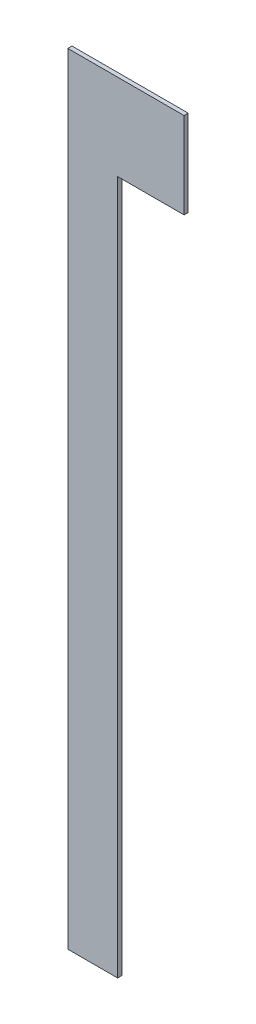
ISO-10303-21;
HEADER;
FILE_DESCRIPTION(('STEP AP214'),'2;1');
FILE_NAME('part.step','',(''),(''),'','','');
FILE_SCHEMA(('AUTOMOTIVE_DESIGN { 1 0 10303 214 1 1 1 1 }'));
ENDSEC;
DATA;
#1=APPLICATION_CONTEXT('core data for automotive mechanical design processes');
#2=APPLICATION_PROTOCOL_DEFINITION('international standard','automotive_design',2000,#1);
#3=PRODUCT_CONTEXT('',#1,'mechanical');
#4=PRODUCT('Part','Part','',(#3));
#5=PRODUCT_RELATED_PRODUCT_CATEGORY('part','',(#4));
#6=PRODUCT_DEFINITION_FORMATION('','',#4);
#7=PRODUCT_DEFINITION_CONTEXT('part definition',#1,'design');
#8=PRODUCT_DEFINITION('design','',#6,#7);
#9=PRODUCT_DEFINITION_SHAPE('','',#8);
#10=(LENGTH_UNIT() NAMED_UNIT(*) SI_UNIT(.MILLI.,.METRE.));
#11=(NAMED_UNIT(*) PLANE_ANGLE_UNIT() SI_UNIT($,.RADIAN.));
#12=(NAMED_UNIT(*) SI_UNIT($,.STERADIAN.) SOLID_ANGLE_UNIT());
#13=UNCERTAINTY_MEASURE_WITH_UNIT(LENGTH_MEASURE(1.E-05),#10,'distance_accuracy_value','');
#14=(GEOMETRIC_REPRESENTATION_CONTEXT(3) GLOBAL_UNCERTAINTY_ASSIGNED_CONTEXT((#13)) GLOBAL_UNIT_ASSIGNED_CONTEXT((#10,
#11,#12)) REPRESENTATION_CONTEXT('',''));
#15=CARTESIAN_POINT('',(0.,0.,0.));
#16=DIRECTION('',(0.,0.,1.));
#17=DIRECTION('',(1.,0.,0.));
#18=AXIS2_PLACEMENT_3D('',#15,#16,#17);
#19=CARTESIAN_POINT('',(350.000000000001,-0.749999999998696,-12.5));
#20=DIRECTION('',(1.,0.,0.));
#21=DIRECTION('',(0.,0.,-1.));
#22=AXIS2_PLACEMENT_3D('',#19,#20,#21);
#23=PLANE('',#22);
#24=DIRECTION('',(0.,1.,0.));
#25=VECTOR('',#24,1.);
#26=CARTESIAN_POINT('',(350.000000000001,-0.749999999998696,0.));
#27=LINE('',#26,#25);
#28=CARTESIAN_POINT('',(350.000000000001,-259.999999999998,0.));
#29=VERTEX_POINT('',#28);
#30=CARTESIAN_POINT('',(350.000000000001,-0.749999999998696,0.));
#31=VERTEX_POINT('',#30);
#32=EDGE_CURVE('E120',#29,#31,#27,.T.);
#33=ORIENTED_EDGE('',*,*,#32,.F.);
#34=DIRECTION('',(0.,0.,1.));
#35=VECTOR('',#34,1.);
#36=CARTESIAN_POINT('',(350.000000000001,-259.999999999998,-12.5));
#37=LINE('',#36,#35);
#38=CARTESIAN_POINT('',(350.000000000001,-259.999999999998,-12.5));
#39=VERTEX_POINT('',#38);
#40=EDGE_CURVE('E11',#39,#29,#37,.T.);
#41=ORIENTED_EDGE('',*,*,#40,.F.);
#42=DIRECTION('',(0.,1.,0.));
#43=VECTOR('',#42,1.);
#44=CARTESIAN_POINT('',(350.000000000001,-0.749999999998696,-12.5));
#45=LINE('',#44,#43);
#46=CARTESIAN_POINT('',(350.000000000001,-0.749999999998696,-12.5));
#47=VERTEX_POINT('',#46);
#48=EDGE_CURVE('E134',#39,#47,#45,.T.);
#49=ORIENTED_EDGE('',*,*,#48,.T.);
#50=DIRECTION('',(0.,0.,1.));
#51=VECTOR('',#50,1.);
#52=CARTESIAN_POINT('',(350.000000000001,-0.749999999998696,-12.5));
#53=LINE('',#52,#51);
#54=EDGE_CURVE('E38',#47,#31,#53,.T.);
#55=ORIENTED_EDGE('',*,*,#54,.T.);
#56=EDGE_LOOP('',(#33,#41,#49,#55));
#57=FACE_BOUND('',#56,.T.);
#58=ADVANCED_FACE('F35',(#57),#23,.T.);
#59=CARTESIAN_POINT('',(150.,-259.999999999998,-12.5));
#60=DIRECTION('',(0.,-1.,0.));
#61=DIRECTION('',(0.,0.,-1.));
#62=AXIS2_PLACEMENT_3D('',#59,#60,#61);
#63=PLANE('',#62);
#64=DIRECTION('',(1.,0.,0.));
#65=VECTOR('',#64,1.);
#66=CARTESIAN_POINT('',(150.,-259.999999999998,0.));
#67=LINE('',#66,#65);
#68=CARTESIAN_POINT('',(150.,-259.999999999998,0.));
#69=VERTEX_POINT('',#68);
#70=EDGE_CURVE('E132',#69,#29,#67,.T.);
#71=ORIENTED_EDGE('',*,*,#70,.F.);
#72=DIRECTION('',(0.,0.,1.));
#73=VECTOR('',#72,1.);
#74=CARTESIAN_POINT('',(150.,-259.999999999998,-12.5));
#75=LINE('',#74,#73);
#76=CARTESIAN_POINT('',(150.,-259.999999999998,-12.5));
#77=VERTEX_POINT('',#76);
#78=EDGE_CURVE('E44',#77,#69,#75,.T.);
#79=ORIENTED_EDGE('',*,*,#78,.F.);
#80=DIRECTION('',(1.,0.,0.));
#81=VECTOR('',#80,1.);
#82=CARTESIAN_POINT('',(150.,-259.999999999998,-12.5));
#83=LINE('',#82,#81);
#84=EDGE_CURVE('E110',#77,#39,#83,.T.);
#85=ORIENTED_EDGE('',*,*,#84,.T.);
#86=ORIENTED_EDGE('',*,*,#40,.T.);
#87=EDGE_LOOP('',(#71,#79,#85,#86));
#88=FACE_BOUND('',#87,.T.);
#89=ADVANCED_FACE('F142',(#88),#63,.T.);
#90=CARTESIAN_POINT('',(150.,-2350.,-12.5));
#91=DIRECTION('',(1.,0.,0.));
#92=DIRECTION('',(0.,0.,-1.));
#93=AXIS2_PLACEMENT_3D('',#90,#91,#92);
#94=PLANE('',#93);
#95=DIRECTION('',(0.,1.,0.));
#96=VECTOR('',#95,1.);
#97=CARTESIAN_POINT('',(150.,-2350.,0.));
#98=LINE('',#97,#96);
#99=CARTESIAN_POINT('',(150.,-2350.,0.));
#100=VERTEX_POINT('',#99);
#101=EDGE_CURVE('E97',#100,#69,#98,.T.);
#102=ORIENTED_EDGE('',*,*,#101,.F.);
#103=DIRECTION('',(0.,0.,1.));
#104=VECTOR('',#103,1.);
#105=CARTESIAN_POINT('',(150.,-2350.,-12.5));
#106=LINE('',#105,#104);
#107=CARTESIAN_POINT('',(150.,-2350.,-12.5));
#108=VERTEX_POINT('',#107);
#109=EDGE_CURVE('E92',#108,#100,#106,.T.);
#110=ORIENTED_EDGE('',*,*,#109,.F.);
#111=DIRECTION('',(0.,1.,0.));
#112=VECTOR('',#111,1.);
#113=CARTESIAN_POINT('',(150.,-2350.,-12.5));
#114=LINE('',#113,#112);
#115=EDGE_CURVE('E95',#108,#77,#114,.T.);
#116=ORIENTED_EDGE('',*,*,#115,.T.);
#117=ORIENTED_EDGE('',*,*,#78,.T.);
#118=EDGE_LOOP('',(#102,#110,#116,#117));
#119=FACE_BOUND('',#118,.T.);
#120=ADVANCED_FACE('F94',(#119),#94,.T.);
#121=CARTESIAN_POINT('',(150.,-2350.,-12.5));
#122=DIRECTION('',(0.,-1.,0.));
#123=DIRECTION('',(0.,0.,-1.));
#124=AXIS2_PLACEMENT_3D('',#121,#122,#123);
#125=PLANE('',#124);
#126=DIRECTION('',(1.,0.,0.));
#127=VECTOR('',#126,1.);
#128=CARTESIAN_POINT('',(150.,-2350.,0.));
#129=LINE('',#128,#127);
#130=CARTESIAN_POINT('',(-4.44089209850063E-13,-2350.,0.));
#131=VERTEX_POINT('',#130);
#132=EDGE_CURVE('E129',#131,#100,#129,.T.);
#133=ORIENTED_EDGE('',*,*,#132,.F.);
#134=DIRECTION('',(0.,0.,1.));
#135=VECTOR('',#134,1.);
#136=CARTESIAN_POINT('',(-4.44089209850063E-13,-2350.,-12.5));
#137=LINE('',#136,#135);
#138=CARTESIAN_POINT('',(-4.44089209850063E-13,-2350.,-12.5));
#139=VERTEX_POINT('',#138);
#140=EDGE_CURVE('E102',#139,#131,#137,.T.);
#141=ORIENTED_EDGE('',*,*,#140,.F.);
#142=DIRECTION('',(1.,0.,0.));
#143=VECTOR('',#142,1.);
#144=CARTESIAN_POINT('',(150.,-2350.,-12.5));
#145=LINE('',#144,#143);
#146=EDGE_CURVE('E108',#139,#108,#145,.T.);
#147=ORIENTED_EDGE('',*,*,#146,.T.);
#148=ORIENTED_EDGE('',*,*,#109,.T.);
#149=EDGE_LOOP('',(#133,#141,#147,#148));
#150=FACE_BOUND('',#149,.T.);
#151=ADVANCED_FACE('F112',(#150),#125,.T.);
#152=CARTESIAN_POINT('',(0.,-0.749999999998696,-12.5));
#153=DIRECTION('',(-1.,0.,0.));
#154=DIRECTION('',(0.,-1.,0.));
#155=AXIS2_PLACEMENT_3D('',#152,#153,#154);
#156=PLANE('',#155);
#157=DIRECTION('',(0.,-1.,0.));
#158=VECTOR('',#157,1.);
#159=CARTESIAN_POINT('',(0.,-0.749999999998696,0.));
#160=LINE('',#159,#158);
#161=CARTESIAN_POINT('',(0.,-0.749999999998696,0.));
#162=VERTEX_POINT('',#161);
#163=EDGE_CURVE('E126',#162,#131,#160,.T.);
#164=ORIENTED_EDGE('',*,*,#163,.F.);
#165=DIRECTION('',(0.,0.,1.));
#166=VECTOR('',#165,1.);
#167=CARTESIAN_POINT('',(0.,-0.749999999998696,-12.5));
#168=LINE('',#167,#166);
#169=CARTESIAN_POINT('',(0.,-0.749999999998696,-12.5));
#170=VERTEX_POINT('',#169);
#171=EDGE_CURVE('E137',#170,#162,#168,.T.);
#172=ORIENTED_EDGE('',*,*,#171,.F.);
#173=DIRECTION('',(0.,-1.,0.));
#174=VECTOR('',#173,1.);
#175=CARTESIAN_POINT('',(0.,-0.749999999998696,-12.5));
#176=LINE('',#175,#174);
#177=EDGE_CURVE('E113',#170,#139,#176,.T.);
#178=ORIENTED_EDGE('',*,*,#177,.T.);
#179=ORIENTED_EDGE('',*,*,#140,.T.);
#180=EDGE_LOOP('',(#164,#172,#178,#179));
#181=FACE_BOUND('',#180,.T.);
#182=ADVANCED_FACE('F155',(#181),#156,.T.);
#183=CARTESIAN_POINT('',(350.000000000001,-0.749999999998696,-12.5));
#184=DIRECTION('',(0.,1.,0.));
#185=DIRECTION('',(0.,0.,1.));
#186=AXIS2_PLACEMENT_3D('',#183,#184,#185);
#187=PLANE('',#186);
#188=DIRECTION('',(-1.,0.,0.));
#189=VECTOR('',#188,1.);
#190=CARTESIAN_POINT('',(350.000000000001,-0.749999999998696,0.));
#191=LINE('',#190,#189);
#192=EDGE_CURVE('E123',#31,#162,#191,.T.);
#193=ORIENTED_EDGE('',*,*,#192,.F.);
#194=ORIENTED_EDGE('',*,*,#54,.F.);
#195=DIRECTION('',(-1.,0.,0.));
#196=VECTOR('',#195,1.);
#197=CARTESIAN_POINT('',(350.000000000001,-0.749999999998696,-12.5));
#198=LINE('',#197,#196);
#199=EDGE_CURVE('E115',#47,#170,#198,.T.);
#200=ORIENTED_EDGE('',*,*,#199,.T.);
#201=ORIENTED_EDGE('',*,*,#171,.T.);
#202=EDGE_LOOP('',(#193,#194,#200,#201));
#203=FACE_BOUND('',#202,.T.);
#204=ADVANCED_FACE('F139',(#203),#187,.T.);
#205=CARTESIAN_POINT('',(0.,0.,-12.5));
#206=DIRECTION('',(0.,0.,1.));
#207=DIRECTION('',(1.,0.,0.));
#208=AXIS2_PLACEMENT_3D('',#205,#206,#207);
#209=PLANE('',#208);
#210=ORIENTED_EDGE('',*,*,#48,.F.);
#211=ORIENTED_EDGE('',*,*,#84,.F.);
#212=ORIENTED_EDGE('',*,*,#115,.F.);
#213=ORIENTED_EDGE('',*,*,#146,.F.);
#214=ORIENTED_EDGE('',*,*,#177,.F.);
#215=ORIENTED_EDGE('',*,*,#199,.F.);
#216=EDGE_LOOP('',(#210,#211,#212,#213,#214,#215));
#217=FACE_BOUND('',#216,.T.);
#218=ADVANCED_FACE('F106',(#217),#209,.F.);
#219=CARTESIAN_POINT('',(0.,0.,0.));
#220=DIRECTION('',(0.,0.,1.));
#221=DIRECTION('',(1.,0.,0.));
#222=AXIS2_PLACEMENT_3D('',#219,#220,#221);
#223=PLANE('',#222);
#224=ORIENTED_EDGE('',*,*,#32,.T.);
#225=ORIENTED_EDGE('',*,*,#192,.T.);
#226=ORIENTED_EDGE('',*,*,#163,.T.);
#227=ORIENTED_EDGE('',*,*,#132,.T.);
#228=ORIENTED_EDGE('',*,*,#101,.T.);
#229=ORIENTED_EDGE('',*,*,#70,.T.);
#230=EDGE_LOOP('',(#224,#225,#226,#227,#228,#229));
#231=FACE_BOUND('',#230,.T.);
#232=ADVANCED_FACE('F141',(#231),#223,.T.);
#233=CLOSED_SHELL('',(#58,#89,#120,#151,#182,#204,#218,#232));
#234=MANIFOLD_SOLID_BREP('B2',#233);
#235=ADVANCED_BREP_SHAPE_REPRESENTATION('',(#18,#234),#14);
#236=SHAPE_DEFINITION_REPRESENTATION(#9,#235);
ENDSEC;
END-ISO-10303-21;
